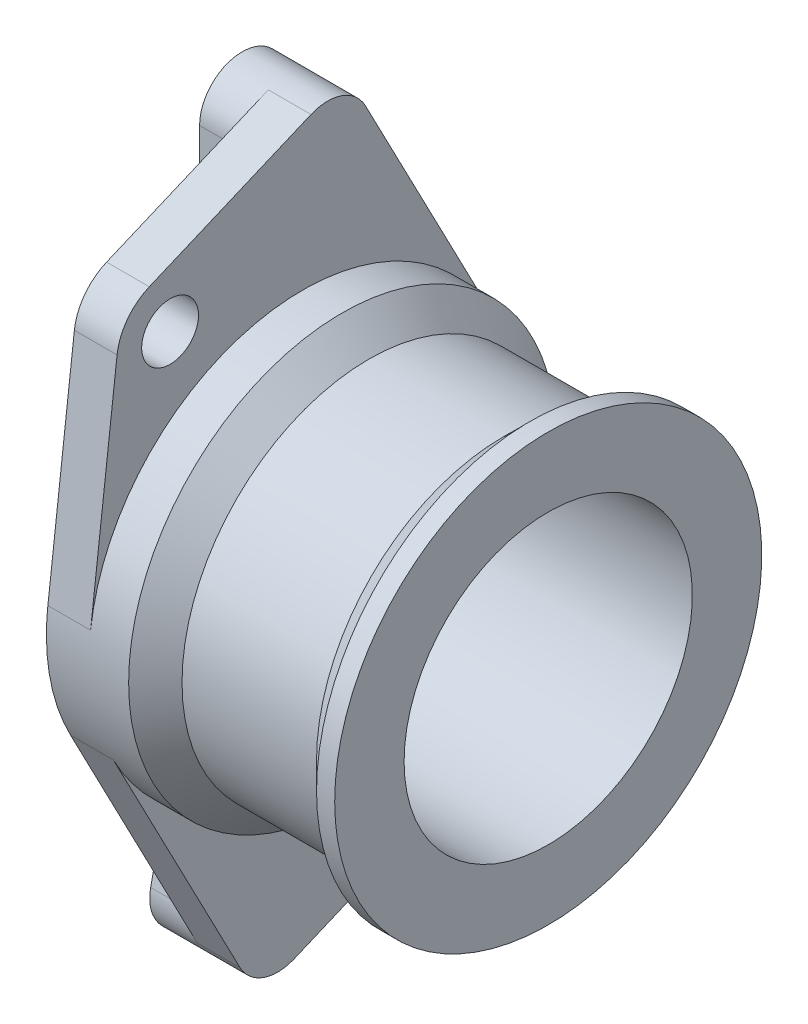
ISO-10303-21;
HEADER;
FILE_DESCRIPTION(('STEP AP214'),'2;1');
FILE_NAME('part.step','',(''),(''),'','','');
FILE_SCHEMA(('AUTOMOTIVE_DESIGN { 1 0 10303 214 1 1 1 1 }'));
ENDSEC;
DATA;
#1=APPLICATION_CONTEXT('core data for automotive mechanical design processes');
#2=APPLICATION_PROTOCOL_DEFINITION('international standard','automotive_design',2000,#1);
#3=PRODUCT_CONTEXT('',#1,'mechanical');
#4=PRODUCT('Part','Part','',(#3));
#5=PRODUCT_RELATED_PRODUCT_CATEGORY('part','',(#4));
#6=PRODUCT_DEFINITION_FORMATION('','',#4);
#7=PRODUCT_DEFINITION_CONTEXT('part definition',#1,'design');
#8=PRODUCT_DEFINITION('design','',#6,#7);
#9=PRODUCT_DEFINITION_SHAPE('','',#8);
#10=(LENGTH_UNIT() NAMED_UNIT(*) SI_UNIT(.MILLI.,.METRE.));
#11=(NAMED_UNIT(*) PLANE_ANGLE_UNIT() SI_UNIT($,.RADIAN.));
#12=(NAMED_UNIT(*) SI_UNIT($,.STERADIAN.) SOLID_ANGLE_UNIT());
#13=UNCERTAINTY_MEASURE_WITH_UNIT(LENGTH_MEASURE(1.E-05),#10,'distance_accuracy_value','');
#14=(GEOMETRIC_REPRESENTATION_CONTEXT(3) GLOBAL_UNCERTAINTY_ASSIGNED_CONTEXT((#13)) GLOBAL_UNIT_ASSIGNED_CONTEXT((#10,
#11,#12)) REPRESENTATION_CONTEXT('',''));
#15=CARTESIAN_POINT('',(0.,0.,0.));
#16=DIRECTION('',(0.,0.,1.));
#17=DIRECTION('',(1.,0.,0.));
#18=AXIS2_PLACEMENT_3D('',#15,#16,#17);
#19=CARTESIAN_POINT('',(19.05,0.,0.));
#20=DIRECTION('',(-1.,0.,0.));
#21=DIRECTION('',(0.,0.,1.));
#22=AXIS2_PLACEMENT_3D('',#19,#20,#21);
#23=CYLINDRICAL_SURFACE('',#22,17.145);
#24=CARTESIAN_POINT('',(0.,0.,0.));
#25=DIRECTION('',(-1.,0.,0.));
#26=DIRECTION('',(0.,0.,1.));
#27=AXIS2_PLACEMENT_3D('',#24,#25,#26);
#28=CIRCLE('',#27,17.145);
#29=CARTESIAN_POINT('',(0.,0.,17.145));
#30=VERTEX_POINT('',#29);
#31=EDGE_CURVE('E12',#30,#30,#28,.T.);
#32=ORIENTED_EDGE('',*,*,#31,.T.);
#33=EDGE_LOOP('',(#32));
#34=FACE_BOUND('',#33,.T.);
#35=CARTESIAN_POINT('',(34.29,0.,0.));
#36=DIRECTION('',(-1.,0.,0.));
#37=DIRECTION('',(0.,0.,1.));
#38=AXIS2_PLACEMENT_3D('',#35,#36,#37);
#39=CIRCLE('',#38,17.145);
#40=CARTESIAN_POINT('',(34.29,0.,17.145));
#41=VERTEX_POINT('',#40);
#42=EDGE_CURVE('E29',#41,#41,#39,.T.);
#43=ORIENTED_EDGE('',*,*,#42,.F.);
#44=EDGE_LOOP('',(#43));
#45=FACE_BOUND('',#44,.T.);
#46=ADVANCED_FACE('F20',(#34,#45),#23,.F.);
#47=CARTESIAN_POINT('',(34.29,0.,21.2725));
#48=DIRECTION('',(1.,0.,0.));
#49=DIRECTION('',(0.,0.,-1.));
#50=AXIS2_PLACEMENT_3D('',#47,#48,#49);
#51=PLANE('',#50);
#52=ORIENTED_EDGE('',*,*,#42,.T.);
#53=EDGE_LOOP('',(#52));
#54=FACE_BOUND('',#53,.T.);
#55=CARTESIAN_POINT('',(34.29,0.,0.));
#56=DIRECTION('',(-1.,0.,0.));
#57=DIRECTION('',(0.,0.,1.));
#58=AXIS2_PLACEMENT_3D('',#55,#56,#57);
#59=CIRCLE('',#58,25.4);
#60=CARTESIAN_POINT('',(34.29,0.,25.4));
#61=VERTEX_POINT('',#60);
#62=EDGE_CURVE('E359',#61,#61,#59,.T.);
#63=ORIENTED_EDGE('',*,*,#62,.F.);
#64=EDGE_LOOP('',(#63));
#65=FACE_BOUND('',#64,.T.);
#66=ADVANCED_FACE('F396',(#54,#65),#51,.T.);
#67=CARTESIAN_POINT('',(19.05,0.,0.));
#68=DIRECTION('',(-1.,0.,0.));
#69=DIRECTION('',(0.,0.,1.));
#70=AXIS2_PLACEMENT_3D('',#67,#68,#69);
#71=CYLINDRICAL_SURFACE('',#70,25.4);
#72=CARTESIAN_POINT('',(32.13,0.,0.));
#73=DIRECTION('',(-1.,0.,0.));
#74=DIRECTION('',(0.,0.,1.));
#75=AXIS2_PLACEMENT_3D('',#72,#73,#74);
#76=CIRCLE('',#75,25.4);
#77=CARTESIAN_POINT('',(32.13,0.,25.4));
#78=VERTEX_POINT('',#77);
#79=EDGE_CURVE('E353',#78,#78,#76,.T.);
#80=ORIENTED_EDGE('',*,*,#79,.F.);
#81=EDGE_LOOP('',(#80));
#82=FACE_BOUND('',#81,.T.);
#83=ORIENTED_EDGE('',*,*,#62,.T.);
#84=EDGE_LOOP('',(#83));
#85=FACE_BOUND('',#84,.T.);
#86=ADVANCED_FACE('F400',(#82,#85),#71,.T.);
#87=CARTESIAN_POINT('',(32.13,0.,0.));
#88=DIRECTION('',(1.,0.,0.));
#89=DIRECTION('',(0.,0.,-1.));
#90=AXIS2_PLACEMENT_3D('',#87,#88,#89);
#91=CONICAL_SURFACE('',#90,25.4,0.785398163397448);
#92=CARTESIAN_POINT('',(28.955,0.,0.));
#93=DIRECTION('',(-1.,0.,0.));
#94=DIRECTION('',(0.,0.,1.));
#95=AXIS2_PLACEMENT_3D('',#92,#93,#94);
#96=CIRCLE('',#95,22.225);
#97=CARTESIAN_POINT('',(28.955,0.,22.225));
#98=VERTEX_POINT('',#97);
#99=EDGE_CURVE('E360',#98,#98,#96,.T.);
#100=ORIENTED_EDGE('',*,*,#99,.F.);
#101=EDGE_LOOP('',(#100));
#102=FACE_BOUND('',#101,.T.);
#103=ORIENTED_EDGE('',*,*,#79,.T.);
#104=EDGE_LOOP('',(#103));
#105=FACE_BOUND('',#104,.T.);
#106=ADVANCED_FACE('F392',(#102,#105),#91,.T.);
#107=CARTESIAN_POINT('',(19.05,0.,0.));
#108=DIRECTION('',(-1.,0.,0.));
#109=DIRECTION('',(0.,0.,1.));
#110=AXIS2_PLACEMENT_3D('',#107,#108,#109);
#111=CYLINDRICAL_SURFACE('',#110,22.225);
#112=CARTESIAN_POINT('',(12.955,0.,0.));
#113=DIRECTION('',(-1.,0.,0.));
#114=DIRECTION('',(0.,0.,1.));
#115=AXIS2_PLACEMENT_3D('',#112,#113,#114);
#116=CIRCLE('',#115,22.225);
#117=CARTESIAN_POINT('',(12.955,0.,22.225));
#118=VERTEX_POINT('',#117);
#119=EDGE_CURVE('E368',#118,#118,#116,.T.);
#120=ORIENTED_EDGE('',*,*,#119,.F.);
#121=EDGE_LOOP('',(#120));
#122=FACE_BOUND('',#121,.T.);
#123=ORIENTED_EDGE('',*,*,#99,.T.);
#124=EDGE_LOOP('',(#123));
#125=FACE_BOUND('',#124,.T.);
#126=ADVANCED_FACE('F384',(#122,#125),#111,.T.);
#127=CARTESIAN_POINT('',(12.955,0.,0.));
#128=DIRECTION('',(-1.,0.,0.));
#129=DIRECTION('',(0.,0.,1.));
#130=AXIS2_PLACEMENT_3D('',#127,#128,#129);
#131=CONICAL_SURFACE('',#130,22.225,0.785398163397448);
#132=CARTESIAN_POINT('',(9.78,0.,0.));
#133=DIRECTION('',(-1.,0.,0.));
#134=DIRECTION('',(0.,0.,1.));
#135=AXIS2_PLACEMENT_3D('',#132,#133,#134);
#136=CIRCLE('',#135,25.4);
#137=CARTESIAN_POINT('',(9.78,0.,25.4));
#138=VERTEX_POINT('',#137);
#139=EDGE_CURVE('E346',#138,#138,#136,.T.);
#140=ORIENTED_EDGE('',*,*,#139,.F.);
#141=EDGE_LOOP('',(#140));
#142=FACE_BOUND('',#141,.T.);
#143=ORIENTED_EDGE('',*,*,#119,.T.);
#144=EDGE_LOOP('',(#143));
#145=FACE_BOUND('',#144,.T.);
#146=ADVANCED_FACE('F382',(#142,#145),#131,.T.);
#147=CARTESIAN_POINT('',(19.05,0.,0.));
#148=DIRECTION('',(-1.,0.,0.));
#149=DIRECTION('',(0.,0.,1.));
#150=AXIS2_PLACEMENT_3D('',#147,#148,#149);
#151=CYLINDRICAL_SURFACE('',#150,25.4);
#152=DIRECTION('',(-1.,0.,0.));
#153=VECTOR('',#152,1.);
#154=CARTESIAN_POINT('',(5.08,11.7342693401619,-22.527026502682));
#155=LINE('',#154,#153);
#156=CARTESIAN_POINT('',(5.08,11.7342693401619,-22.527026502682));
#157=VERTEX_POINT('',#156);
#158=CARTESIAN_POINT('',(0.,11.7342693401619,-22.527026502682));
#159=VERTEX_POINT('',#158);
#160=EDGE_CURVE('E36',#157,#159,#155,.T.);
#161=ORIENTED_EDGE('',*,*,#160,.F.);
#162=CARTESIAN_POINT('',(5.08,0.,0.));
#163=DIRECTION('',(1.,0.,0.));
#164=DIRECTION('',(0.,0.,1.));
#165=AXIS2_PLACEMENT_3D('',#162,#163,#164);
#166=CIRCLE('',#165,25.4);
#167=CARTESIAN_POINT('',(5.08,2.96713935223001,25.2260992637476));
#168=VERTEX_POINT('',#167);
#169=EDGE_CURVE('E41',#157,#168,#166,.T.);
#170=ORIENTED_EDGE('',*,*,#169,.T.);
#171=DIRECTION('',(-1.,0.,0.));
#172=VECTOR('',#171,1.);
#173=CARTESIAN_POINT('',(5.08,2.96713935223001,25.2260992637476));
#174=LINE('',#173,#172);
#175=CARTESIAN_POINT('',(0.,2.96713935223001,25.2260992637476));
#176=VERTEX_POINT('',#175);
#177=EDGE_CURVE('E338',#168,#176,#174,.T.);
#178=ORIENTED_EDGE('',*,*,#177,.T.);
#179=CARTESIAN_POINT('',(0.,0.,0.));
#180=DIRECTION('',(-1.,0.,0.));
#181=DIRECTION('',(0.,0.,1.));
#182=AXIS2_PLACEMENT_3D('',#179,#180,#181);
#183=CIRCLE('',#182,25.4);
#184=CARTESIAN_POINT('',(0.,-11.7342693401619,22.527026502682));
#185=VERTEX_POINT('',#184);
#186=EDGE_CURVE('E334',#185,#176,#183,.T.);
#187=ORIENTED_EDGE('',*,*,#186,.F.);
#188=DIRECTION('',(-1.,0.,0.));
#189=VECTOR('',#188,1.);
#190=CARTESIAN_POINT('',(5.08,-11.7342693401619,22.527026502682));
#191=LINE('',#190,#189);
#192=CARTESIAN_POINT('',(5.08,-11.7342693401619,22.527026502682));
#193=VERTEX_POINT('',#192);
#194=EDGE_CURVE('E330',#193,#185,#191,.T.);
#195=ORIENTED_EDGE('',*,*,#194,.F.);
#196=CARTESIAN_POINT('',(5.08,0.,0.));
#197=DIRECTION('',(1.,0.,0.));
#198=DIRECTION('',(0.,0.,-1.));
#199=AXIS2_PLACEMENT_3D('',#196,#197,#198);
#200=CIRCLE('',#199,25.4);
#201=CARTESIAN_POINT('',(5.08,-2.96713935223,-25.2260992637476));
#202=VERTEX_POINT('',#201);
#203=EDGE_CURVE('E326',#193,#202,#200,.T.);
#204=ORIENTED_EDGE('',*,*,#203,.T.);
#205=DIRECTION('',(-1.,0.,0.));
#206=VECTOR('',#205,1.);
#207=CARTESIAN_POINT('',(5.08,-2.96713935223001,-25.2260992637476));
#208=LINE('',#207,#206);
#209=CARTESIAN_POINT('',(0.,-2.96713935223,-25.2260992637476));
#210=VERTEX_POINT('',#209);
#211=EDGE_CURVE('E323',#202,#210,#208,.T.);
#212=ORIENTED_EDGE('',*,*,#211,.T.);
#213=EDGE_CURVE('E327',#159,#210,#183,.T.);
#214=ORIENTED_EDGE('',*,*,#213,.F.);
#215=EDGE_LOOP('',(#161,#170,#178,#187,#195,#204,#212,#214));
#216=FACE_BOUND('',#215,.T.);
#217=ORIENTED_EDGE('',*,*,#139,.T.);
#218=EDGE_LOOP('',(#217));
#219=FACE_BOUND('',#218,.T.);
#220=ADVANCED_FACE('F380',(#216,#219),#151,.T.);
#221=CARTESIAN_POINT('',(0.,0.,21.2725));
#222=DIRECTION('',(-1.,0.,0.));
#223=DIRECTION('',(0.,0.,1.));
#224=AXIS2_PLACEMENT_3D('',#221,#222,#223);
#225=PLANE('',#224);
#226=CARTESIAN_POINT('',(0.,38.3206980670754,-2.96616859215302));
#227=DIRECTION('',(-1.,0.,0.));
#228=DIRECTION('',(0.,0.,1.));
#229=AXIS2_PLACEMENT_3D('',#226,#227,#228);
#230=CIRCLE('',#229,5.065970436656);
#231=CARTESIAN_POINT('',(0.,40.6610705699502,-7.45913120193071));
#232=VERTEX_POINT('',#231);
#233=CARTESIAN_POINT('',(0.,37.2674235879575,-7.92143542015649));
#234=VERTEX_POINT('',#233);
#235=EDGE_CURVE('E320',#232,#234,#230,.T.);
#236=ORIENTED_EDGE('',*,*,#235,.F.);
#237=DIRECTION('',(0.,0.886890807192205,0.461979107880389));
#238=VECTOR('',#237,1.);
#239=CARTESIAN_POINT('',(0.,26.197669955056,-14.9930788523064));
#240=LINE('',#239,#238);
#241=EDGE_CURVE('E321',#159,#232,#240,.T.);
#242=ORIENTED_EDGE('',*,*,#241,.F.);
#243=ORIENTED_EDGE('',*,*,#213,.T.);
#244=DIRECTION('',(0.,0.993153514320772,-0.116816509930315));
#245=VECTOR('',#244,1.);
#246=CARTESIAN_POINT('',(0.,-16.360155114024,-23.6507885628592));
#247=LINE('',#246,#245);
#248=CARTESIAN_POINT('',(0.,-29.753170875818,-22.0754778619708));
#249=VERTEX_POINT('',#248);
#250=EDGE_CURVE('E261',#249,#210,#247,.T.);
#251=ORIENTED_EDGE('',*,*,#250,.F.);
#252=CARTESIAN_POINT('',(0.,-29.0113860377605,-15.7689530460338));
#253=DIRECTION('',(1.,0.,0.));
#254=DIRECTION('',(0.,0.,-1.));
#255=AXIS2_PLACEMENT_3D('',#252,#253,#254);
#256=CIRCLE('',#255,6.35);
#257=CARTESIAN_POINT('',(0.,-34.8607609051211,-18.2402510169574));
#258=VERTEX_POINT('',#257);
#259=EDGE_CURVE('E255',#258,#249,#256,.T.);
#260=ORIENTED_EDGE('',*,*,#259,.F.);
#261=DIRECTION('',(0.,0.38918078282261,-0.921161396434729));
#262=VECTOR('',#261,1.);
#263=CARTESIAN_POINT('',(0.,-38.9240176869618,-8.62283038254918));
#264=LINE('',#263,#262);
#265=CARTESIAN_POINT('',(0.,-42.9872744688026,0.994590251859044));
#266=VERTEX_POINT('',#265);
#267=EDGE_CURVE('E249',#266,#258,#264,.T.);
#268=ORIENTED_EDGE('',*,*,#267,.F.);
#269=CARTESIAN_POINT('',(0.,-38.3206980670754,2.96616859215302));
#270=DIRECTION('',(-1.,0.,0.));
#271=DIRECTION('',(0.,0.,-1.));
#272=AXIS2_PLACEMENT_3D('',#269,#270,#271);
#273=CIRCLE('',#272,5.065970436656);
#274=CARTESIAN_POINT('',(0.,-38.3206980670754,-2.09980184450297));
#275=VERTEX_POINT('',#274);
#276=EDGE_CURVE('E256',#275,#266,#273,.T.);
#277=ORIENTED_EDGE('',*,*,#276,.F.);
#278=DIRECTION('',(0.,-1.,0.));
#279=VECTOR('',#278,1.);
#280=CARTESIAN_POINT('',(0.,-34.5141495879358,-2.09980184450297));
#281=LINE('',#280,#279);
#282=CARTESIAN_POINT('',(0.,-30.7076011087963,-2.09980184450297));
#283=VERTEX_POINT('',#282);
#284=EDGE_CURVE('E274',#283,#275,#281,.T.);
#285=ORIENTED_EDGE('',*,*,#284,.F.);
#286=CARTESIAN_POINT('',(0.,-30.7076011087963,2.16599985834967));
#287=DIRECTION('',(-1.,0.,0.));
#288=DIRECTION('',(0.,0.,-1.));
#289=AXIS2_PLACEMENT_3D('',#286,#287,#288);
#290=CIRCLE('',#289,4.26580170285261);
#291=CARTESIAN_POINT('',(0.,-29.8206910640629,6.3385835592011));
#292=VERTEX_POINT('',#291);
#293=EDGE_CURVE('E270',#292,#283,#290,.T.);
#294=ORIENTED_EDGE('',*,*,#293,.F.);
#295=DIRECTION('',(0.,0.978147600733806,-0.207911690817758));
#296=VECTOR('',#295,1.);
#297=CARTESIAN_POINT('',(0.,-33.5440573260102,7.1300094896788));
#298=LINE('',#297,#296);
#299=CARTESIAN_POINT('',(0.,-37.2674235879575,7.92143542015648));
#300=VERTEX_POINT('',#299);
#301=EDGE_CURVE('E238',#300,#292,#298,.T.);
#302=ORIENTED_EDGE('',*,*,#301,.F.);
#303=CARTESIAN_POINT('',(0.,-40.6610705699502,7.45913120193071));
#304=VERTEX_POINT('',#303);
#305=EDGE_CURVE('E237',#304,#300,#273,.T.);
#306=ORIENTED_EDGE('',*,*,#305,.F.);
#307=DIRECTION('',(0.,-0.886890807192205,-0.461979107880389));
#308=VECTOR('',#307,1.);
#309=CARTESIAN_POINT('',(0.,-26.197669955056,14.9930788523064));
#310=LINE('',#309,#308);
#311=EDGE_CURVE('E232',#185,#304,#310,.T.);
#312=ORIENTED_EDGE('',*,*,#311,.F.);
#313=ORIENTED_EDGE('',*,*,#186,.T.);
#314=DIRECTION('',(0.,-0.993153514320772,0.116816509930315));
#315=VECTOR('',#314,1.);
#316=CARTESIAN_POINT('',(0.,16.360155114024,23.6507885628592));
#317=LINE('',#316,#315);
#318=CARTESIAN_POINT('',(0.,29.753170875818,22.0754778619707));
#319=VERTEX_POINT('',#318);
#320=EDGE_CURVE('E227',#319,#176,#317,.T.);
#321=ORIENTED_EDGE('',*,*,#320,.F.);
#322=CARTESIAN_POINT('',(0.,29.0113860377605,15.7689530460338));
#323=DIRECTION('',(1.,0.,0.));
#324=DIRECTION('',(0.,0.,1.));
#325=AXIS2_PLACEMENT_3D('',#322,#323,#324);
#326=CIRCLE('',#325,6.35);
#327=CARTESIAN_POINT('',(0.,34.8607609051211,18.2402510169574));
#328=VERTEX_POINT('',#327);
#329=EDGE_CURVE('E220',#328,#319,#326,.T.);
#330=ORIENTED_EDGE('',*,*,#329,.F.);
#331=DIRECTION('',(0.,-0.38918078282261,0.921161396434729));
#332=VECTOR('',#331,1.);
#333=CARTESIAN_POINT('',(0.,38.9240176869618,8.62283038254917));
#334=LINE('',#333,#332);
#335=CARTESIAN_POINT('',(0.,42.9872744688026,-0.994590251859045));
#336=VERTEX_POINT('',#335);
#337=EDGE_CURVE('E215',#336,#328,#334,.T.);
#338=ORIENTED_EDGE('',*,*,#337,.F.);
#339=CARTESIAN_POINT('',(0.,38.3206980670754,2.09980184450297));
#340=VERTEX_POINT('',#339);
#341=EDGE_CURVE('E212',#340,#336,#230,.T.);
#342=ORIENTED_EDGE('',*,*,#341,.F.);
#343=DIRECTION('',(0.,1.,0.));
#344=VECTOR('',#343,1.);
#345=CARTESIAN_POINT('',(0.,34.5141495879358,2.09980184450297));
#346=LINE('',#345,#344);
#347=CARTESIAN_POINT('',(0.,30.7076011087963,2.09980184450296));
#348=VERTEX_POINT('',#347);
#349=EDGE_CURVE('E207',#348,#340,#346,.T.);
#350=ORIENTED_EDGE('',*,*,#349,.F.);
#351=CARTESIAN_POINT('',(0.,30.7076011087963,-2.16599985834968));
#352=DIRECTION('',(-1.,0.,0.));
#353=DIRECTION('',(0.,0.,1.));
#354=AXIS2_PLACEMENT_3D('',#351,#352,#353);
#355=CIRCLE('',#354,4.26580170285261);
#356=CARTESIAN_POINT('',(0.,29.8206910640629,-6.3385835592011));
#357=VERTEX_POINT('',#356);
#358=EDGE_CURVE('E213',#357,#348,#355,.T.);
#359=ORIENTED_EDGE('',*,*,#358,.F.);
#360=DIRECTION('',(0.,-0.978147600733806,0.207911690817758));
#361=VECTOR('',#360,1.);
#362=CARTESIAN_POINT('',(0.,33.5440573260102,-7.1300094896788));
#363=LINE('',#362,#361);
#364=EDGE_CURVE('E177',#234,#357,#363,.T.);
#365=ORIENTED_EDGE('',*,*,#364,.F.);
#366=EDGE_LOOP('',(#236,#242,#243,#251,#260,#268,#277,#285,#294,#302,#306,#312,#313,#321,#330,
#338,#342,#350,#359,#365));
#367=FACE_BOUND('',#366,.T.);
#368=CARTESIAN_POINT('',(0.,29.0113860377605,15.7689530460338));
#369=DIRECTION('',(1.,0.,0.));
#370=DIRECTION('',(0.,0.,-1.));
#371=AXIS2_PLACEMENT_3D('',#368,#369,#370);
#372=CIRCLE('',#371,3.3782);
#373=CARTESIAN_POINT('',(0.,29.0113860377605,12.3907530460338));
#374=VERTEX_POINT('',#373);
#375=EDGE_CURVE('E309',#374,#374,#372,.T.);
#376=ORIENTED_EDGE('',*,*,#375,.T.);
#377=EDGE_LOOP('',(#376));
#378=FACE_BOUND('',#377,.T.);
#379=CARTESIAN_POINT('',(0.,-29.0113860377605,-15.7689530460338));
#380=DIRECTION('',(1.,0.,0.));
#381=DIRECTION('',(0.,0.,-1.));
#382=AXIS2_PLACEMENT_3D('',#379,#380,#381);
#383=CIRCLE('',#382,3.3782);
#384=CARTESIAN_POINT('',(0.,-29.0113860377605,-19.1471530460338));
#385=VERTEX_POINT('',#384);
#386=EDGE_CURVE('E304',#385,#385,#383,.T.);
#387=ORIENTED_EDGE('',*,*,#386,.T.);
#388=EDGE_LOOP('',(#387));
#389=FACE_BOUND('',#388,.T.);
#390=ORIENTED_EDGE('',*,*,#31,.F.);
#391=EDGE_LOOP('',(#390));
#392=FACE_BOUND('',#391,.T.);
#393=ADVANCED_FACE('F390',(#367,#378,#389,#392),#225,.T.);
#394=CARTESIAN_POINT('',(5.08,-26.197669955056,14.9930788523064));
#395=DIRECTION('',(0.,0.461979107880389,-0.886890807192205));
#396=DIRECTION('',(0.,0.886890807192205,0.461979107880389));
#397=AXIS2_PLACEMENT_3D('',#394,#395,#396);
#398=PLANE('',#397);
#399=ORIENTED_EDGE('',*,*,#311,.T.);
#400=DIRECTION('',(-1.,0.,0.));
#401=VECTOR('',#400,1.);
#402=CARTESIAN_POINT('',(5.08,-40.6610705699502,7.45913120193071));
#403=LINE('',#402,#401);
#404=CARTESIAN_POINT('',(5.08,-40.6610705699502,7.45913120193071));
#405=VERTEX_POINT('',#404);
#406=EDGE_CURVE('E299',#405,#304,#403,.T.);
#407=ORIENTED_EDGE('',*,*,#406,.F.);
#408=DIRECTION('',(0.,-0.886890807192205,-0.461979107880389));
#409=VECTOR('',#408,1.);
#410=CARTESIAN_POINT('',(5.08,-26.197669955056,14.9930788523064));
#411=LINE('',#410,#409);
#412=EDGE_CURVE('E295',#193,#405,#411,.T.);
#413=ORIENTED_EDGE('',*,*,#412,.F.);
#414=ORIENTED_EDGE('',*,*,#194,.T.);
#415=EDGE_LOOP('',(#399,#407,#413,#414));
#416=FACE_BOUND('',#415,.T.);
#417=ADVANCED_FACE('F454',(#416),#398,.F.);
#418=CARTESIAN_POINT('',(5.08,-38.3206980670754,2.96616859215302));
#419=DIRECTION('',(-1.,0.,0.));
#420=DIRECTION('',(0.,0.,1.));
#421=AXIS2_PLACEMENT_3D('',#418,#419,#420);
#422=CYLINDRICAL_SURFACE('',#421,5.065970436656);
#423=ORIENTED_EDGE('',*,*,#406,.T.);
#424=ORIENTED_EDGE('',*,*,#305,.T.);
#425=DIRECTION('',(1.,0.,0.));
#426=VECTOR('',#425,1.);
#427=CARTESIAN_POINT('',(-5.08,-37.2674235879575,7.92143542015648));
#428=LINE('',#427,#426);
#429=CARTESIAN_POINT('',(-5.08,-37.2674235879575,7.92143542015648));
#430=VERTEX_POINT('',#429);
#431=EDGE_CURVE('E289',#430,#300,#428,.T.);
#432=ORIENTED_EDGE('',*,*,#431,.F.);
#433=CARTESIAN_POINT('',(-5.08,-38.3206980670754,2.96616859215302));
#434=DIRECTION('',(-1.,0.,0.));
#435=DIRECTION('',(0.,0.,-1.));
#436=AXIS2_PLACEMENT_3D('',#433,#434,#435);
#437=CIRCLE('',#436,5.065970436656);
#438=CARTESIAN_POINT('',(-5.08,-38.3206980670754,-2.09980184450297));
#439=VERTEX_POINT('',#438);
#440=EDGE_CURVE('E283',#439,#430,#437,.T.);
#441=ORIENTED_EDGE('',*,*,#440,.F.);
#442=DIRECTION('',(1.,0.,0.));
#443=VECTOR('',#442,1.);
#444=CARTESIAN_POINT('',(-5.08,-38.3206980670754,-2.09980184450297));
#445=LINE('',#444,#443);
#446=EDGE_CURVE('E290',#439,#275,#445,.T.);
#447=ORIENTED_EDGE('',*,*,#446,.T.);
#448=ORIENTED_EDGE('',*,*,#276,.T.);
#449=DIRECTION('',(-1.,0.,0.));
#450=VECTOR('',#449,1.);
#451=CARTESIAN_POINT('',(5.08,-42.9872744688026,0.994590251859044));
#452=LINE('',#451,#450);
#453=CARTESIAN_POINT('',(5.08,-42.9872744688026,0.994590251859044));
#454=VERTEX_POINT('',#453);
#455=EDGE_CURVE('E802',#454,#266,#452,.T.);
#456=ORIENTED_EDGE('',*,*,#455,.F.);
#457=CARTESIAN_POINT('',(5.08,-38.3206980670754,2.96616859215302));
#458=DIRECTION('',(-1.,0.,0.));
#459=DIRECTION('',(0.,0.,-1.));
#460=AXIS2_PLACEMENT_3D('',#457,#458,#459);
#461=CIRCLE('',#460,5.065970436656);
#462=EDGE_CURVE('E799',#454,#405,#461,.T.);
#463=ORIENTED_EDGE('',*,*,#462,.T.);
#464=EDGE_LOOP('',(#423,#424,#432,#441,#447,#448,#456,#463));
#465=FACE_BOUND('',#464,.T.);
#466=ADVANCED_FACE('F464',(#465),#422,.T.);
#467=CARTESIAN_POINT('',(5.08,-38.9240176869618,-8.62283038254918));
#468=DIRECTION('',(0.,0.921161396434729,0.38918078282261));
#469=DIRECTION('',(0.,-0.38918078282261,0.921161396434729));
#470=AXIS2_PLACEMENT_3D('',#467,#468,#469);
#471=PLANE('',#470);
#472=ORIENTED_EDGE('',*,*,#267,.T.);
#473=DIRECTION('',(-1.,0.,0.));
#474=VECTOR('',#473,1.);
#475=CARTESIAN_POINT('',(5.08,-34.8607609051211,-18.2402510169574));
#476=LINE('',#475,#474);
#477=CARTESIAN_POINT('',(5.08,-34.8607609051211,-18.2402510169574));
#478=VERTEX_POINT('',#477);
#479=EDGE_CURVE('E795',#478,#258,#476,.T.);
#480=ORIENTED_EDGE('',*,*,#479,.F.);
#481=DIRECTION('',(0.,0.38918078282261,-0.921161396434729));
#482=VECTOR('',#481,1.);
#483=CARTESIAN_POINT('',(5.08,-38.9240176869618,-8.62283038254918));
#484=LINE('',#483,#482);
#485=EDGE_CURVE('E791',#454,#478,#484,.T.);
#486=ORIENTED_EDGE('',*,*,#485,.F.);
#487=ORIENTED_EDGE('',*,*,#455,.T.);
#488=EDGE_LOOP('',(#472,#480,#486,#487));
#489=FACE_BOUND('',#488,.T.);
#490=ADVANCED_FACE('F474',(#489),#471,.F.);
#491=CARTESIAN_POINT('',(5.08,-29.0113860377605,-15.7689530460338));
#492=DIRECTION('',(-1.,0.,0.));
#493=DIRECTION('',(0.,0.,1.));
#494=AXIS2_PLACEMENT_3D('',#491,#492,#493);
#495=CYLINDRICAL_SURFACE('',#494,6.35);
#496=ORIENTED_EDGE('',*,*,#259,.T.);
#497=DIRECTION('',(-1.,0.,0.));
#498=VECTOR('',#497,1.);
#499=CARTESIAN_POINT('',(5.08,-29.753170875818,-22.0754778619708));
#500=LINE('',#499,#498);
#501=CARTESIAN_POINT('',(5.08,-29.753170875818,-22.0754778619708));
#502=VERTEX_POINT('',#501);
#503=EDGE_CURVE('E787',#502,#249,#500,.T.);
#504=ORIENTED_EDGE('',*,*,#503,.F.);
#505=CARTESIAN_POINT('',(5.08,-29.0113860377605,-15.7689530460338));
#506=DIRECTION('',(1.,0.,0.));
#507=DIRECTION('',(0.,0.,-1.));
#508=AXIS2_PLACEMENT_3D('',#505,#506,#507);
#509=CIRCLE('',#508,6.35);
#510=EDGE_CURVE('E783',#478,#502,#509,.T.);
#511=ORIENTED_EDGE('',*,*,#510,.F.);
#512=ORIENTED_EDGE('',*,*,#479,.T.);
#513=EDGE_LOOP('',(#496,#504,#511,#512));
#514=FACE_BOUND('',#513,.T.);
#515=ADVANCED_FACE('F484',(#514),#495,.T.);
#516=CARTESIAN_POINT('',(5.08,-16.360155114024,-23.6507885628592));
#517=DIRECTION('',(0.,0.116816509930315,0.993153514320772));
#518=DIRECTION('',(0.,-0.993153514320772,0.116816509930315));
#519=AXIS2_PLACEMENT_3D('',#516,#517,#518);
#520=PLANE('',#519);
#521=ORIENTED_EDGE('',*,*,#250,.T.);
#522=ORIENTED_EDGE('',*,*,#211,.F.);
#523=DIRECTION('',(0.,0.993153514320772,-0.116816509930315));
#524=VECTOR('',#523,1.);
#525=CARTESIAN_POINT('',(5.08,-16.360155114024,-23.6507885628592));
#526=LINE('',#525,#524);
#527=EDGE_CURVE('E779',#502,#202,#526,.T.);
#528=ORIENTED_EDGE('',*,*,#527,.F.);
#529=ORIENTED_EDGE('',*,*,#503,.T.);
#530=EDGE_LOOP('',(#521,#522,#528,#529));
#531=FACE_BOUND('',#530,.T.);
#532=ADVANCED_FACE('F494',(#531),#520,.F.);
#533=CARTESIAN_POINT('',(5.08,-4.788138393445,0.));
#534=DIRECTION('',(1.,0.,0.));
#535=DIRECTION('',(0.,1.,0.));
#536=AXIS2_PLACEMENT_3D('',#533,#534,#535);
#537=PLANE('',#536);
#538=CARTESIAN_POINT('',(5.08,-29.0113860377605,-15.7689530460338));
#539=DIRECTION('',(1.,0.,0.));
#540=DIRECTION('',(0.,0.,-1.));
#541=AXIS2_PLACEMENT_3D('',#538,#539,#540);
#542=CIRCLE('',#541,3.3782);
#543=CARTESIAN_POINT('',(5.08,-29.0113860377605,-19.1471530460338));
#544=VERTEX_POINT('',#543);
#545=EDGE_CURVE('E774',#544,#544,#542,.T.);
#546=ORIENTED_EDGE('',*,*,#545,.F.);
#547=EDGE_LOOP('',(#546));
#548=FACE_BOUND('',#547,.T.);
#549=ORIENTED_EDGE('',*,*,#412,.T.);
#550=ORIENTED_EDGE('',*,*,#462,.F.);
#551=ORIENTED_EDGE('',*,*,#485,.T.);
#552=ORIENTED_EDGE('',*,*,#510,.T.);
#553=ORIENTED_EDGE('',*,*,#527,.T.);
#554=ORIENTED_EDGE('',*,*,#203,.F.);
#555=EDGE_LOOP('',(#549,#550,#551,#552,#553,#554));
#556=FACE_BOUND('',#555,.T.);
#557=ADVANCED_FACE('F504',(#548,#556),#537,.T.);
#558=CARTESIAN_POINT('',(0.,-29.0113860377605,-15.7689530460338));
#559=DIRECTION('',(1.,0.,0.));
#560=DIRECTION('',(0.,0.,-1.));
#561=AXIS2_PLACEMENT_3D('',#558,#559,#560);
#562=CYLINDRICAL_SURFACE('',#561,3.3782);
#563=ORIENTED_EDGE('',*,*,#545,.T.);
#564=EDGE_LOOP('',(#563));
#565=FACE_BOUND('',#564,.T.);
#566=ORIENTED_EDGE('',*,*,#386,.F.);
#567=EDGE_LOOP('',(#566));
#568=FACE_BOUND('',#567,.T.);
#569=ADVANCED_FACE('F514',(#565,#568),#562,.F.);
#570=CARTESIAN_POINT('',(-5.08,-34.5141495879358,-2.09980184450297));
#571=DIRECTION('',(0.,0.,1.));
#572=DIRECTION('',(0.,-1.,0.));
#573=AXIS2_PLACEMENT_3D('',#570,#571,#572);
#574=PLANE('',#573);
#575=ORIENTED_EDGE('',*,*,#284,.T.);
#576=ORIENTED_EDGE('',*,*,#446,.F.);
#577=DIRECTION('',(0.,-1.,0.));
#578=VECTOR('',#577,1.);
#579=CARTESIAN_POINT('',(-5.08,-34.5141495879358,-2.09980184450297));
#580=LINE('',#579,#578);
#581=CARTESIAN_POINT('',(-5.08,-30.7076011087963,-2.09980184450297));
#582=VERTEX_POINT('',#581);
#583=EDGE_CURVE('E771',#582,#439,#580,.T.);
#584=ORIENTED_EDGE('',*,*,#583,.F.);
#585=DIRECTION('',(1.,0.,0.));
#586=VECTOR('',#585,1.);
#587=CARTESIAN_POINT('',(-5.08,-30.7076011087963,-2.09980184450297));
#588=LINE('',#587,#586);
#589=EDGE_CURVE('E767',#582,#283,#588,.T.);
#590=ORIENTED_EDGE('',*,*,#589,.T.);
#591=EDGE_LOOP('',(#575,#576,#584,#590));
#592=FACE_BOUND('',#591,.T.);
#593=ADVANCED_FACE('F524',(#592),#574,.F.);
#594=CARTESIAN_POINT('',(-5.08,-30.7076011087963,2.16599985834967));
#595=DIRECTION('',(1.,0.,0.));
#596=DIRECTION('',(0.,0.,-1.));
#597=AXIS2_PLACEMENT_3D('',#594,#595,#596);
#598=CYLINDRICAL_SURFACE('',#597,4.26580170285261);
#599=ORIENTED_EDGE('',*,*,#293,.T.);
#600=ORIENTED_EDGE('',*,*,#589,.F.);
#601=CARTESIAN_POINT('',(-5.08,-30.7076011087963,2.16599985834967));
#602=DIRECTION('',(-1.,0.,0.));
#603=DIRECTION('',(0.,0.,-1.));
#604=AXIS2_PLACEMENT_3D('',#601,#602,#603);
#605=CIRCLE('',#604,4.26580170285261);
#606=CARTESIAN_POINT('',(-5.08,-29.8206910640629,6.3385835592011));
#607=VERTEX_POINT('',#606);
#608=EDGE_CURVE('E763',#607,#582,#605,.T.);
#609=ORIENTED_EDGE('',*,*,#608,.F.);
#610=DIRECTION('',(1.,0.,0.));
#611=VECTOR('',#610,1.);
#612=CARTESIAN_POINT('',(-5.08,-29.8206910640629,6.3385835592011));
#613=LINE('',#612,#611);
#614=EDGE_CURVE('E759',#607,#292,#613,.T.);
#615=ORIENTED_EDGE('',*,*,#614,.T.);
#616=EDGE_LOOP('',(#599,#600,#609,#615));
#617=FACE_BOUND('',#616,.T.);
#618=ADVANCED_FACE('F534',(#617),#598,.T.);
#619=CARTESIAN_POINT('',(-5.08,-33.5440573260102,7.1300094896788));
#620=DIRECTION('',(0.,-0.207911690817759,-0.978147600733806));
#621=DIRECTION('',(0.,0.978147600733806,-0.207911690817759));
#622=AXIS2_PLACEMENT_3D('',#619,#620,#621);
#623=PLANE('',#622);
#624=ORIENTED_EDGE('',*,*,#301,.T.);
#625=ORIENTED_EDGE('',*,*,#614,.F.);
#626=DIRECTION('',(0.,0.978147600733806,-0.207911690817758));
#627=VECTOR('',#626,1.);
#628=CARTESIAN_POINT('',(-5.08,-33.5440573260102,7.1300094896788));
#629=LINE('',#628,#627);
#630=EDGE_CURVE('E755',#430,#607,#629,.T.);
#631=ORIENTED_EDGE('',*,*,#630,.F.);
#632=ORIENTED_EDGE('',*,*,#431,.T.);
#633=EDGE_LOOP('',(#624,#625,#631,#632));
#634=FACE_BOUND('',#633,.T.);
#635=ADVANCED_FACE('F544',(#634),#623,.F.);
#636=CARTESIAN_POINT('',(-5.08,-4.788138393445,0.));
#637=DIRECTION('',(1.,0.,0.));
#638=DIRECTION('',(0.,1.,0.));
#639=AXIS2_PLACEMENT_3D('',#636,#637,#638);
#640=PLANE('',#639);
#641=ORIENTED_EDGE('',*,*,#440,.T.);
#642=ORIENTED_EDGE('',*,*,#630,.T.);
#643=ORIENTED_EDGE('',*,*,#608,.T.);
#644=ORIENTED_EDGE('',*,*,#583,.T.);
#645=EDGE_LOOP('',(#641,#642,#643,#644));
#646=FACE_BOUND('',#645,.T.);
#647=ADVANCED_FACE('F554',(#646),#640,.F.);
#648=CARTESIAN_POINT('',(5.08,26.197669955056,-14.9930788523064));
#649=DIRECTION('',(0.,-0.461979107880389,0.886890807192205));
#650=DIRECTION('',(0.,-0.886890807192205,-0.461979107880389));
#651=AXIS2_PLACEMENT_3D('',#648,#649,#650);
#652=PLANE('',#651);
#653=ORIENTED_EDGE('',*,*,#241,.T.);
#654=DIRECTION('',(-1.,0.,0.));
#655=VECTOR('',#654,1.);
#656=CARTESIAN_POINT('',(5.08,40.6610705699502,-7.45913120193072));
#657=LINE('',#656,#655);
#658=CARTESIAN_POINT('',(5.08,40.6610705699502,-7.45913120193072));
#659=VERTEX_POINT('',#658);
#660=EDGE_CURVE('E751',#659,#232,#657,.T.);
#661=ORIENTED_EDGE('',*,*,#660,.F.);
#662=DIRECTION('',(0.,0.886890807192205,0.461979107880389));
#663=VECTOR('',#662,1.);
#664=CARTESIAN_POINT('',(5.08,26.197669955056,-14.9930788523064));
#665=LINE('',#664,#663);
#666=EDGE_CURVE('E747',#157,#659,#665,.T.);
#667=ORIENTED_EDGE('',*,*,#666,.F.);
#668=ORIENTED_EDGE('',*,*,#160,.T.);
#669=EDGE_LOOP('',(#653,#661,#667,#668));
#670=FACE_BOUND('',#669,.T.);
#671=ADVANCED_FACE('F564',(#670),#652,.F.);
#672=CARTESIAN_POINT('',(5.08,38.3206980670754,-2.96616859215302));
#673=DIRECTION('',(-1.,0.,0.));
#674=DIRECTION('',(0.,0.,1.));
#675=AXIS2_PLACEMENT_3D('',#672,#673,#674);
#676=CYLINDRICAL_SURFACE('',#675,5.065970436656);
#677=ORIENTED_EDGE('',*,*,#660,.T.);
#678=ORIENTED_EDGE('',*,*,#235,.T.);
#679=DIRECTION('',(1.,0.,0.));
#680=VECTOR('',#679,1.);
#681=CARTESIAN_POINT('',(-5.08,37.2674235879575,-7.92143542015649));
#682=LINE('',#681,#680);
#683=CARTESIAN_POINT('',(-5.08,37.2674235879575,-7.92143542015649));
#684=VERTEX_POINT('',#683);
#685=EDGE_CURVE('E740',#684,#234,#682,.T.);
#686=ORIENTED_EDGE('',*,*,#685,.F.);
#687=CARTESIAN_POINT('',(-5.08,38.3206980670754,-2.96616859215302));
#688=DIRECTION('',(-1.,0.,0.));
#689=DIRECTION('',(0.,0.,1.));
#690=AXIS2_PLACEMENT_3D('',#687,#688,#689);
#691=CIRCLE('',#690,5.065970436656);
#692=CARTESIAN_POINT('',(-5.08,38.3206980670754,2.09980184450297));
#693=VERTEX_POINT('',#692);
#694=EDGE_CURVE('E181',#693,#684,#691,.T.);
#695=ORIENTED_EDGE('',*,*,#694,.F.);
#696=DIRECTION('',(1.,0.,0.));
#697=VECTOR('',#696,1.);
#698=CARTESIAN_POINT('',(-5.08,38.3206980670754,2.09980184450297));
#699=LINE('',#698,#697);
#700=EDGE_CURVE('E731',#693,#340,#699,.T.);
#701=ORIENTED_EDGE('',*,*,#700,.T.);
#702=ORIENTED_EDGE('',*,*,#341,.T.);
#703=DIRECTION('',(-1.,0.,0.));
#704=VECTOR('',#703,1.);
#705=CARTESIAN_POINT('',(5.08,42.9872744688026,-0.994590251859049));
#706=LINE('',#705,#704);
#707=CARTESIAN_POINT('',(5.08,42.9872744688026,-0.994590251859049));
#708=VERTEX_POINT('',#707);
#709=EDGE_CURVE('E736',#708,#336,#706,.T.);
#710=ORIENTED_EDGE('',*,*,#709,.F.);
#711=CARTESIAN_POINT('',(5.08,38.3206980670754,-2.96616859215302));
#712=DIRECTION('',(-1.,0.,0.));
#713=DIRECTION('',(0.,0.,1.));
#714=AXIS2_PLACEMENT_3D('',#711,#712,#713);
#715=CIRCLE('',#714,5.065970436656);
#716=EDGE_CURVE('E741',#708,#659,#715,.T.);
#717=ORIENTED_EDGE('',*,*,#716,.T.);
#718=EDGE_LOOP('',(#677,#678,#686,#695,#701,#702,#710,#717));
#719=FACE_BOUND('',#718,.T.);
#720=ADVANCED_FACE('F574',(#719),#676,.T.);
#721=CARTESIAN_POINT('',(5.08,38.9240176869618,8.62283038254917));
#722=DIRECTION('',(0.,-0.921161396434729,-0.38918078282261));
#723=DIRECTION('',(0.,0.38918078282261,-0.921161396434729));
#724=AXIS2_PLACEMENT_3D('',#721,#722,#723);
#725=PLANE('',#724);
#726=ORIENTED_EDGE('',*,*,#337,.T.);
#727=DIRECTION('',(-1.,0.,0.));
#728=VECTOR('',#727,1.);
#729=CARTESIAN_POINT('',(5.08,34.8607609051211,18.2402510169574));
#730=LINE('',#729,#728);
#731=CARTESIAN_POINT('',(5.08,34.8607609051211,18.2402510169574));
#732=VERTEX_POINT('',#731);
#733=EDGE_CURVE('E852',#732,#328,#730,.T.);
#734=ORIENTED_EDGE('',*,*,#733,.F.);
#735=DIRECTION('',(0.,-0.38918078282261,0.921161396434729));
#736=VECTOR('',#735,1.);
#737=CARTESIAN_POINT('',(5.08,38.9240176869618,8.62283038254917));
#738=LINE('',#737,#736);
#739=EDGE_CURVE('E856',#708,#732,#738,.T.);
#740=ORIENTED_EDGE('',*,*,#739,.F.);
#741=ORIENTED_EDGE('',*,*,#709,.T.);
#742=EDGE_LOOP('',(#726,#734,#740,#741));
#743=FACE_BOUND('',#742,.T.);
#744=ADVANCED_FACE('F584',(#743),#725,.F.);
#745=CARTESIAN_POINT('',(5.08,29.0113860377605,15.7689530460338));
#746=DIRECTION('',(-1.,0.,0.));
#747=DIRECTION('',(0.,0.,1.));
#748=AXIS2_PLACEMENT_3D('',#745,#746,#747);
#749=CYLINDRICAL_SURFACE('',#748,6.35);
#750=ORIENTED_EDGE('',*,*,#329,.T.);
#751=DIRECTION('',(-1.,0.,0.));
#752=VECTOR('',#751,1.);
#753=CARTESIAN_POINT('',(5.08,29.753170875818,22.0754778619707));
#754=LINE('',#753,#752);
#755=CARTESIAN_POINT('',(5.08,29.753170875818,22.0754778619707));
#756=VERTEX_POINT('',#755);
#757=EDGE_CURVE('E850',#756,#319,#754,.T.);
#758=ORIENTED_EDGE('',*,*,#757,.F.);
#759=CARTESIAN_POINT('',(5.08,29.0113860377605,15.7689530460338));
#760=DIRECTION('',(1.,0.,0.));
#761=DIRECTION('',(0.,0.,1.));
#762=AXIS2_PLACEMENT_3D('',#759,#760,#761);
#763=CIRCLE('',#762,6.35);
#764=EDGE_CURVE('E857',#732,#756,#763,.T.);
#765=ORIENTED_EDGE('',*,*,#764,.F.);
#766=ORIENTED_EDGE('',*,*,#733,.T.);
#767=EDGE_LOOP('',(#750,#758,#765,#766));
#768=FACE_BOUND('',#767,.T.);
#769=ADVANCED_FACE('F594',(#768),#749,.T.);
#770=CARTESIAN_POINT('',(5.08,16.360155114024,23.6507885628592));
#771=DIRECTION('',(0.,-0.116816509930315,-0.993153514320772));
#772=DIRECTION('',(0.,0.993153514320772,-0.116816509930315));
#773=AXIS2_PLACEMENT_3D('',#770,#771,#772);
#774=PLANE('',#773);
#775=ORIENTED_EDGE('',*,*,#320,.T.);
#776=ORIENTED_EDGE('',*,*,#177,.F.);
#777=DIRECTION('',(0.,-0.993153514320772,0.116816509930315));
#778=VECTOR('',#777,1.);
#779=CARTESIAN_POINT('',(5.08,16.360155114024,23.6507885628592));
#780=LINE('',#779,#778);
#781=EDGE_CURVE('E196',#756,#168,#780,.T.);
#782=ORIENTED_EDGE('',*,*,#781,.F.);
#783=ORIENTED_EDGE('',*,*,#757,.T.);
#784=EDGE_LOOP('',(#775,#776,#782,#783));
#785=FACE_BOUND('',#784,.T.);
#786=ADVANCED_FACE('F604',(#785),#774,.F.);
#787=CARTESIAN_POINT('',(5.08,4.788138393445,0.));
#788=DIRECTION('',(1.,0.,0.));
#789=DIRECTION('',(0.,-1.,0.));
#790=AXIS2_PLACEMENT_3D('',#787,#788,#789);
#791=PLANE('',#790);
#792=CARTESIAN_POINT('',(5.08,29.0113860377605,15.7689530460338));
#793=DIRECTION('',(1.,0.,0.));
#794=DIRECTION('',(0.,0.,-1.));
#795=AXIS2_PLACEMENT_3D('',#792,#793,#794);
#796=CIRCLE('',#795,3.3782);
#797=CARTESIAN_POINT('',(5.08,29.0113860377605,12.3907530460338));
#798=VERTEX_POINT('',#797);
#799=EDGE_CURVE('E191',#798,#798,#796,.T.);
#800=ORIENTED_EDGE('',*,*,#799,.F.);
#801=EDGE_LOOP('',(#800));
#802=FACE_BOUND('',#801,.T.);
#803=ORIENTED_EDGE('',*,*,#666,.T.);
#804=ORIENTED_EDGE('',*,*,#716,.F.);
#805=ORIENTED_EDGE('',*,*,#739,.T.);
#806=ORIENTED_EDGE('',*,*,#764,.T.);
#807=ORIENTED_EDGE('',*,*,#781,.T.);
#808=ORIENTED_EDGE('',*,*,#169,.F.);
#809=EDGE_LOOP('',(#803,#804,#805,#806,#807,#808));
#810=FACE_BOUND('',#809,.T.);
#811=ADVANCED_FACE('F614',(#802,#810),#791,.T.);
#812=CARTESIAN_POINT('',(0.,29.0113860377605,15.7689530460338));
#813=DIRECTION('',(1.,0.,0.));
#814=DIRECTION('',(0.,0.,-1.));
#815=AXIS2_PLACEMENT_3D('',#812,#813,#814);
#816=CYLINDRICAL_SURFACE('',#815,3.3782);
#817=ORIENTED_EDGE('',*,*,#799,.T.);
#818=EDGE_LOOP('',(#817));
#819=FACE_BOUND('',#818,.T.);
#820=ORIENTED_EDGE('',*,*,#375,.F.);
#821=EDGE_LOOP('',(#820));
#822=FACE_BOUND('',#821,.T.);
#823=ADVANCED_FACE('F624',(#819,#822),#816,.F.);
#824=CARTESIAN_POINT('',(-5.08,34.5141495879358,2.09980184450297));
#825=DIRECTION('',(0.,0.,-1.));
#826=DIRECTION('',(0.,1.,0.));
#827=AXIS2_PLACEMENT_3D('',#824,#825,#826);
#828=PLANE('',#827);
#829=ORIENTED_EDGE('',*,*,#349,.T.);
#830=ORIENTED_EDGE('',*,*,#700,.F.);
#831=DIRECTION('',(0.,1.,0.));
#832=VECTOR('',#831,1.);
#833=CARTESIAN_POINT('',(-5.08,34.5141495879358,2.09980184450297));
#834=LINE('',#833,#832);
#835=CARTESIAN_POINT('',(-5.08,30.7076011087963,2.09980184450296));
#836=VERTEX_POINT('',#835);
#837=EDGE_CURVE('E188',#836,#693,#834,.T.);
#838=ORIENTED_EDGE('',*,*,#837,.F.);
#839=DIRECTION('',(1.,0.,0.));
#840=VECTOR('',#839,1.);
#841=CARTESIAN_POINT('',(-5.08,30.7076011087963,2.09980184450296));
#842=LINE('',#841,#840);
#843=EDGE_CURVE('E165',#836,#348,#842,.T.);
#844=ORIENTED_EDGE('',*,*,#843,.T.);
#845=EDGE_LOOP('',(#829,#830,#838,#844));
#846=FACE_BOUND('',#845,.T.);
#847=ADVANCED_FACE('F634',(#846),#828,.F.);
#848=CARTESIAN_POINT('',(-5.08,30.7076011087963,-2.16599985834968));
#849=DIRECTION('',(1.,0.,0.));
#850=DIRECTION('',(0.,0.,-1.));
#851=AXIS2_PLACEMENT_3D('',#848,#849,#850);
#852=CYLINDRICAL_SURFACE('',#851,4.26580170285261);
#853=ORIENTED_EDGE('',*,*,#358,.T.);
#854=ORIENTED_EDGE('',*,*,#843,.F.);
#855=CARTESIAN_POINT('',(-5.08,30.7076011087963,-2.16599985834968));
#856=DIRECTION('',(-1.,0.,0.));
#857=DIRECTION('',(0.,0.,1.));
#858=AXIS2_PLACEMENT_3D('',#855,#856,#857);
#859=CIRCLE('',#858,4.26580170285261);
#860=CARTESIAN_POINT('',(-5.08,29.8206910640629,-6.3385835592011));
#861=VERTEX_POINT('',#860);
#862=EDGE_CURVE('E158',#861,#836,#859,.T.);
#863=ORIENTED_EDGE('',*,*,#862,.F.);
#864=DIRECTION('',(1.,0.,0.));
#865=VECTOR('',#864,1.);
#866=CARTESIAN_POINT('',(-5.08,29.8206910640629,-6.3385835592011));
#867=LINE('',#866,#865);
#868=EDGE_CURVE('E162',#861,#357,#867,.T.);
#869=ORIENTED_EDGE('',*,*,#868,.T.);
#870=EDGE_LOOP('',(#853,#854,#863,#869));
#871=FACE_BOUND('',#870,.T.);
#872=ADVANCED_FACE('F161',(#871),#852,.T.);
#873=CARTESIAN_POINT('',(-5.08,33.5440573260102,-7.1300094896788));
#874=DIRECTION('',(0.,0.207911690817759,0.978147600733806));
#875=DIRECTION('',(0.,-0.978147600733806,0.207911690817759));
#876=AXIS2_PLACEMENT_3D('',#873,#874,#875);
#877=PLANE('',#876);
#878=ORIENTED_EDGE('',*,*,#364,.T.);
#879=ORIENTED_EDGE('',*,*,#868,.F.);
#880=DIRECTION('',(0.,-0.978147600733806,0.207911690817758));
#881=VECTOR('',#880,1.);
#882=CARTESIAN_POINT('',(-5.08,33.5440573260102,-7.1300094896788));
#883=LINE('',#882,#881);
#884=EDGE_CURVE('E175',#684,#861,#883,.T.);
#885=ORIENTED_EDGE('',*,*,#884,.F.);
#886=ORIENTED_EDGE('',*,*,#685,.T.);
#887=EDGE_LOOP('',(#878,#879,#885,#886));
#888=FACE_BOUND('',#887,.T.);
#889=ADVANCED_FACE('F173',(#888),#877,.F.);
#890=CARTESIAN_POINT('',(-5.08,4.788138393445,0.));
#891=DIRECTION('',(1.,0.,0.));
#892=DIRECTION('',(0.,-1.,0.));
#893=AXIS2_PLACEMENT_3D('',#890,#891,#892);
#894=PLANE('',#893);
#895=ORIENTED_EDGE('',*,*,#694,.T.);
#896=ORIENTED_EDGE('',*,*,#884,.T.);
#897=ORIENTED_EDGE('',*,*,#862,.T.);
#898=ORIENTED_EDGE('',*,*,#837,.T.);
#899=EDGE_LOOP('',(#895,#896,#897,#898));
#900=FACE_BOUND('',#899,.T.);
#901=ADVANCED_FACE('F180',(#900),#894,.F.);
#902=CLOSED_SHELL('',(#46,#66,#86,#106,#126,#146,#220,#393,#417,#466,#490,#515,#532,#557,#569,
#593,#618,#635,#647,#671,#720,#744,#769,#786,#811,#823,#847,#872,#889,#901));
#903=MANIFOLD_SOLID_BREP('B1',#902);
#904=ADVANCED_BREP_SHAPE_REPRESENTATION('',(#18,#903),#14);
#905=SHAPE_DEFINITION_REPRESENTATION(#9,#904);
ENDSEC;
END-ISO-10303-21;
